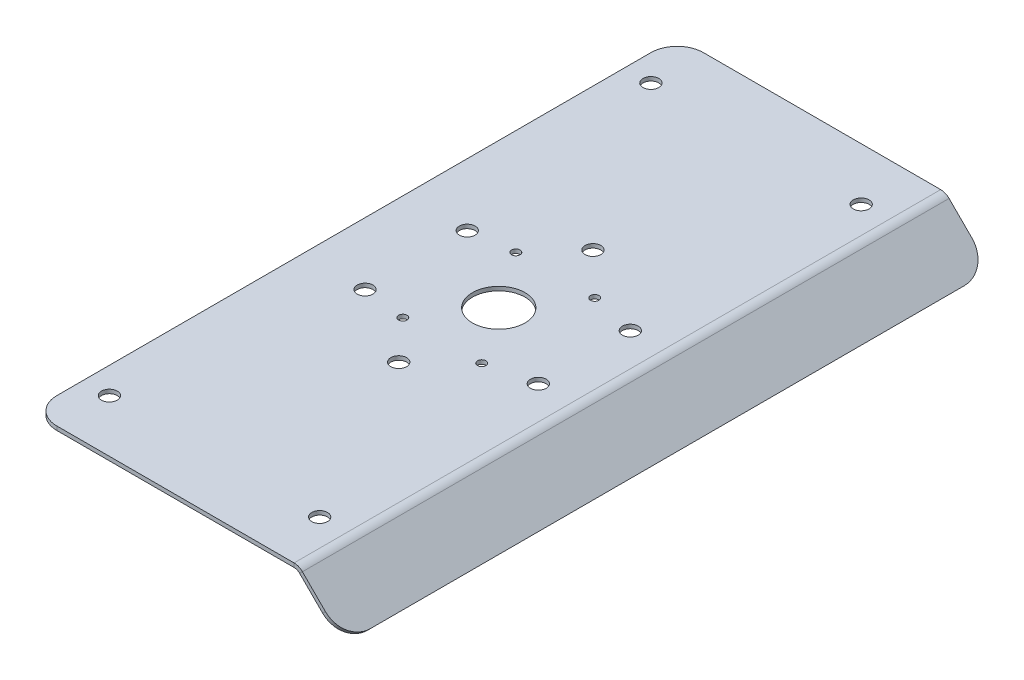
ISO-10303-21;
HEADER;
FILE_DESCRIPTION(('STEP AP214'),'2;1');
FILE_NAME('part.step','',(''),(''),'','','');
FILE_SCHEMA(('AUTOMOTIVE_DESIGN { 1 0 10303 214 1 1 1 1 }'));
ENDSEC;
DATA;
#1=APPLICATION_CONTEXT('core data for automotive mechanical design processes');
#2=APPLICATION_PROTOCOL_DEFINITION('international standard','automotive_design',2000,#1);
#3=PRODUCT_CONTEXT('',#1,'mechanical');
#4=PRODUCT('Part','Part','',(#3));
#5=PRODUCT_RELATED_PRODUCT_CATEGORY('part','',(#4));
#6=PRODUCT_DEFINITION_FORMATION('','',#4);
#7=PRODUCT_DEFINITION_CONTEXT('part definition',#1,'design');
#8=PRODUCT_DEFINITION('design','',#6,#7);
#9=PRODUCT_DEFINITION_SHAPE('','',#8);
#10=(LENGTH_UNIT() NAMED_UNIT(*) SI_UNIT(.MILLI.,.METRE.));
#11=(NAMED_UNIT(*) PLANE_ANGLE_UNIT() SI_UNIT($,.RADIAN.));
#12=(NAMED_UNIT(*) SI_UNIT($,.STERADIAN.) SOLID_ANGLE_UNIT());
#13=UNCERTAINTY_MEASURE_WITH_UNIT(LENGTH_MEASURE(1.E-05),#10,'distance_accuracy_value','');
#14=(GEOMETRIC_REPRESENTATION_CONTEXT(3) GLOBAL_UNCERTAINTY_ASSIGNED_CONTEXT((#13)) GLOBAL_UNIT_ASSIGNED_CONTEXT((#10,
#11,#12)) REPRESENTATION_CONTEXT('',''));
#15=CARTESIAN_POINT('',(0.,0.,0.));
#16=DIRECTION('',(0.,0.,1.));
#17=DIRECTION('',(1.,0.,0.));
#18=AXIS2_PLACEMENT_3D('',#15,#16,#17);
#19=CARTESIAN_POINT('',(-20.9507486527882,97.9999999999998,246.));
#20=DIRECTION('',(0.,0.,1.));
#21=DIRECTION('',(1.,0.,0.));
#22=AXIS2_PLACEMENT_3D('',#19,#20,#21);
#23=PLANE('',#22);
#24=DIRECTION('',(0.,1.,0.));
#25=VECTOR('',#24,1.);
#26=CARTESIAN_POINT('',(-20.9507486527882,97.9999999999998,246.));
#27=LINE('',#26,#25);
#28=CARTESIAN_POINT('',(-20.9507486527882,97.9999999999998,246.));
#29=VERTEX_POINT('',#28);
#30=CARTESIAN_POINT('',(-20.9507486527882,99.4999999999998,246.));
#31=VERTEX_POINT('',#30);
#32=EDGE_CURVE('E139',#29,#31,#27,.T.);
#33=ORIENTED_EDGE('',*,*,#32,.F.);
#34=CARTESIAN_POINT('',(-20.9507486527882,94.9999999999998,246.));
#35=DIRECTION('',(0.,0.,1.));
#36=DIRECTION('',(1.,0.,0.));
#37=AXIS2_PLACEMENT_3D('',#34,#35,#36);
#38=CIRCLE('',#37,3.);
#39=CARTESIAN_POINT('',(-18.8294283092285,97.1213203435595,246.));
#40=VERTEX_POINT('',#39);
#41=EDGE_CURVE('E136',#29,#40,#38,.F.);
#42=ORIENTED_EDGE('',*,*,#41,.T.);
#43=DIRECTION('',(-0.70710678118655,-0.707106781186545,0.));
#44=VECTOR('',#43,1.);
#45=CARTESIAN_POINT('',(-17.7687681374487,98.1819805153393,246.));
#46=LINE('',#45,#44);
#47=CARTESIAN_POINT('',(-17.7687681374487,98.1819805153393,246.));
#48=VERTEX_POINT('',#47);
#49=EDGE_CURVE('E130',#48,#40,#46,.T.);
#50=ORIENTED_EDGE('',*,*,#49,.F.);
#51=CARTESIAN_POINT('',(-20.9507486527882,94.9999999999998,246.));
#52=DIRECTION('',(0.,0.,1.));
#53=DIRECTION('',(1.,0.,0.));
#54=AXIS2_PLACEMENT_3D('',#51,#52,#53);
#55=CIRCLE('',#54,4.5);
#56=EDGE_CURVE('E134',#31,#48,#55,.F.);
#57=ORIENTED_EDGE('',*,*,#56,.F.);
#58=EDGE_LOOP('',(#33,#42,#50,#57));
#59=FACE_BOUND('',#58,.T.);
#60=ADVANCED_FACE('F38',(#59),#23,.T.);
#61=CARTESIAN_POINT('',(-17.7687681374487,98.1819805153393,246.));
#62=DIRECTION('',(0.,0.,1.));
#63=DIRECTION('',(1.,0.,0.));
#64=AXIS2_PLACEMENT_3D('',#61,#62,#63);
#65=PLANE('',#64);
#66=DIRECTION('',(1.,0.,0.));
#67=VECTOR('',#66,1.);
#68=CARTESIAN_POINT('',(-121.208107965669,99.4999999999998,246.));
#69=LINE('',#68,#67);
#70=CARTESIAN_POINT('',(-111.208107965669,99.4999999999998,246.));
#71=VERTEX_POINT('',#70);
#72=EDGE_CURVE('E166',#71,#31,#69,.T.);
#73=ORIENTED_EDGE('',*,*,#72,.F.);
#74=DIRECTION('',(0.,1.,0.));
#75=VECTOR('',#74,1.);
#76=CARTESIAN_POINT('',(-111.208107965669,98.1819805153393,246.));
#77=LINE('',#76,#75);
#78=CARTESIAN_POINT('',(-111.208107965669,97.9999999999998,246.));
#79=VERTEX_POINT('',#78);
#80=EDGE_CURVE('E243',#71,#79,#77,.F.);
#81=ORIENTED_EDGE('',*,*,#80,.T.);
#82=DIRECTION('',(1.,0.,0.));
#83=VECTOR('',#82,1.);
#84=CARTESIAN_POINT('',(-121.208107965669,97.9999999999998,246.));
#85=LINE('',#84,#83);
#86=EDGE_CURVE('E170',#79,#29,#85,.T.);
#87=ORIENTED_EDGE('',*,*,#86,.T.);
#88=ORIENTED_EDGE('',*,*,#32,.T.);
#89=EDGE_LOOP('',(#73,#81,#87,#88));
#90=FACE_BOUND('',#89,.T.);
#91=ADVANCED_FACE('F475',(#90),#65,.T.);
#92=CARTESIAN_POINT('',(-18.8294283092285,97.1213203435595,0.));
#93=DIRECTION('',(0.,0.,-1.));
#94=DIRECTION('',(-1.,0.,0.));
#95=AXIS2_PLACEMENT_3D('',#92,#93,#94);
#96=PLANE('',#95);
#97=DIRECTION('',(0.70710678118655,0.707106781186545,0.));
#98=VECTOR('',#97,1.);
#99=CARTESIAN_POINT('',(-18.8294283092285,97.1213203435595,0.));
#100=LINE('',#99,#98);
#101=CARTESIAN_POINT('',(-18.8294283092285,97.1213203435595,0.));
#102=VERTEX_POINT('',#101);
#103=CARTESIAN_POINT('',(-17.7687681374487,98.1819805153393,0.));
#104=VERTEX_POINT('',#103);
#105=EDGE_CURVE('E140',#102,#104,#100,.T.);
#106=ORIENTED_EDGE('',*,*,#105,.F.);
#107=CARTESIAN_POINT('',(-20.9507486527882,94.9999999999998,0.));
#108=DIRECTION('',(0.,0.,1.));
#109=DIRECTION('',(1.,0.,0.));
#110=AXIS2_PLACEMENT_3D('',#107,#108,#109);
#111=CIRCLE('',#110,3.);
#112=CARTESIAN_POINT('',(-20.9507486527882,97.9999999999998,0.));
#113=VERTEX_POINT('',#112);
#114=EDGE_CURVE('E195',#113,#102,#111,.F.);
#115=ORIENTED_EDGE('',*,*,#114,.F.);
#116=DIRECTION('',(0.,-1.,0.));
#117=VECTOR('',#116,1.);
#118=CARTESIAN_POINT('',(-20.9507486527882,99.4999999999998,0.));
#119=LINE('',#118,#117);
#120=CARTESIAN_POINT('',(-20.9507486527882,99.4999999999998,0.));
#121=VERTEX_POINT('',#120);
#122=EDGE_CURVE('E221',#121,#113,#119,.T.);
#123=ORIENTED_EDGE('',*,*,#122,.F.);
#124=CARTESIAN_POINT('',(-20.9507486527882,94.9999999999998,0.));
#125=DIRECTION('',(0.,0.,1.));
#126=DIRECTION('',(1.,0.,0.));
#127=AXIS2_PLACEMENT_3D('',#124,#125,#126);
#128=CIRCLE('',#127,4.5);
#129=EDGE_CURVE('E186',#121,#104,#128,.F.);
#130=ORIENTED_EDGE('',*,*,#129,.T.);
#131=EDGE_LOOP('',(#106,#115,#123,#130));
#132=FACE_BOUND('',#131,.T.);
#133=ADVANCED_FACE('F473',(#132),#96,.T.);
#134=CARTESIAN_POINT('',(-20.9507486527882,99.4999999999998,0.));
#135=DIRECTION('',(0.,0.,-1.));
#136=DIRECTION('',(-1.,0.,0.));
#137=AXIS2_PLACEMENT_3D('',#134,#135,#136);
#138=PLANE('',#137);
#139=DIRECTION('',(0.707106781186548,-0.707106781186548,0.));
#140=VECTOR('',#139,1.);
#141=CARTESIAN_POINT('',(-18.6474477938891,99.0606601717797,0.));
#142=LINE('',#141,#140);
#143=CARTESIAN_POINT('',(-9.01040764008524,89.4236200179758,0.));
#144=VERTEX_POINT('',#143);
#145=EDGE_CURVE('E150',#104,#144,#142,.T.);
#146=ORIENTED_EDGE('',*,*,#145,.T.);
#147=DIRECTION('',(-0.70710678118655,-0.707106781186545,0.));
#148=VECTOR('',#147,1.);
#149=CARTESIAN_POINT('',(-9.94238815542475,88.4916395026363,0.));
#150=LINE('',#149,#148);
#151=CARTESIAN_POINT('',(-10.0710678118651,88.362959846196,0.));
#152=VERTEX_POINT('',#151);
#153=EDGE_CURVE('E256',#144,#152,#150,.T.);
#154=ORIENTED_EDGE('',*,*,#153,.T.);
#155=DIRECTION('',(0.707106781186547,-0.707106781186547,0.));
#156=VECTOR('',#155,1.);
#157=CARTESIAN_POINT('',(-19.7081079656689,97.9999999999998,0.));
#158=LINE('',#157,#156);
#159=EDGE_CURVE('E179',#102,#152,#158,.T.);
#160=ORIENTED_EDGE('',*,*,#159,.F.);
#161=ORIENTED_EDGE('',*,*,#105,.T.);
#162=EDGE_LOOP('',(#146,#154,#160,#161));
#163=FACE_BOUND('',#162,.T.);
#164=ADVANCED_FACE('F280',(#163),#138,.T.);
#165=CARTESIAN_POINT('',(-19.7081079656689,97.9999999999998,246.));
#166=DIRECTION('',(0.707106781186547,0.707106781186547,0.));
#167=DIRECTION('',(-0.707106781186548,0.707106781186548,0.));
#168=AXIS2_PLACEMENT_3D('',#165,#166,#167);
#169=PLANE('',#168);
#170=ORIENTED_EDGE('',*,*,#159,.T.);
#171=CARTESIAN_POINT('',(-10.0710678118651,88.362959846196,10.));
#172=DIRECTION('',(0.707106781186547,0.707106781186547,0.));
#173=DIRECTION('',(-0.707106781186548,0.707106781186548,0.));
#174=AXIS2_PLACEMENT_3D('',#171,#172,#173);
#175=CIRCLE('',#174,10.);
#176=CARTESIAN_POINT('',(-2.99999999999958,81.2918920343305,10.));
#177=VERTEX_POINT('',#176);
#178=EDGE_CURVE('E263',#152,#177,#175,.F.);
#179=ORIENTED_EDGE('',*,*,#178,.T.);
#180=DIRECTION('',(0.,0.,-1.));
#181=VECTOR('',#180,1.);
#182=CARTESIAN_POINT('',(-2.99999999999958,81.2918920343305,246.));
#183=LINE('',#182,#181);
#184=CARTESIAN_POINT('',(-2.99999999999958,81.2918920343305,236.));
#185=VERTEX_POINT('',#184);
#186=EDGE_CURVE('E218',#185,#177,#183,.T.);
#187=ORIENTED_EDGE('',*,*,#186,.F.);
#188=CARTESIAN_POINT('',(-10.0710678118651,88.362959846196,236.));
#189=DIRECTION('',(0.707106781186547,0.707106781186547,0.));
#190=DIRECTION('',(-0.707106781186548,0.707106781186548,0.));
#191=AXIS2_PLACEMENT_3D('',#188,#189,#190);
#192=CIRCLE('',#191,10.);
#193=CARTESIAN_POINT('',(-10.0710678118651,88.362959846196,246.));
#194=VERTEX_POINT('',#193);
#195=EDGE_CURVE('E260',#185,#194,#192,.F.);
#196=ORIENTED_EDGE('',*,*,#195,.T.);
#197=DIRECTION('',(0.707106781186547,-0.707106781186547,0.));
#198=VECTOR('',#197,1.);
#199=CARTESIAN_POINT('',(-19.7081079656689,97.9999999999998,246.));
#200=LINE('',#199,#198);
#201=EDGE_CURVE('E160',#40,#194,#200,.T.);
#202=ORIENTED_EDGE('',*,*,#201,.F.);
#203=DIRECTION('',(0.,0.,-1.));
#204=VECTOR('',#203,1.);
#205=CARTESIAN_POINT('',(-18.8294283092285,97.1213203435595,246.));
#206=LINE('',#205,#204);
#207=EDGE_CURVE('E178',#40,#102,#206,.T.);
#208=ORIENTED_EDGE('',*,*,#207,.T.);
#209=EDGE_LOOP('',(#170,#179,#187,#196,#202,#208));
#210=FACE_BOUND('',#209,.T.);
#211=ADVANCED_FACE('F285',(#210),#169,.F.);
#212=CARTESIAN_POINT('',(-1.93933982821976,82.3525522061103,246.));
#213=DIRECTION('',(0.707106781186545,-0.70710678118655,0.));
#214=DIRECTION('',(0.70710678118655,0.707106781186545,0.));
#215=AXIS2_PLACEMENT_3D('',#212,#213,#214);
#216=PLANE('',#215);
#217=ORIENTED_EDGE('',*,*,#186,.T.);
#218=DIRECTION('',(-0.70710678118655,-0.707106781186545,0.));
#219=VECTOR('',#218,1.);
#220=CARTESIAN_POINT('',(-1.93933982821976,82.3525522061103,10.));
#221=LINE('',#220,#219);
#222=CARTESIAN_POINT('',(-1.93933982821976,82.3525522061103,10.));
#223=VERTEX_POINT('',#222);
#224=EDGE_CURVE('E60',#177,#223,#221,.F.);
#225=ORIENTED_EDGE('',*,*,#224,.T.);
#226=DIRECTION('',(0.,0.,-1.));
#227=VECTOR('',#226,1.);
#228=CARTESIAN_POINT('',(-1.93933982821976,82.3525522061103,246.));
#229=LINE('',#228,#227);
#230=CARTESIAN_POINT('',(-1.93933982821976,82.3525522061103,236.));
#231=VERTEX_POINT('',#230);
#232=EDGE_CURVE('E155',#231,#223,#229,.T.);
#233=ORIENTED_EDGE('',*,*,#232,.F.);
#234=DIRECTION('',(-0.70710678118655,-0.707106781186545,0.));
#235=VECTOR('',#234,1.);
#236=CARTESIAN_POINT('',(-1.93933982821976,82.3525522061103,236.));
#237=LINE('',#236,#235);
#238=EDGE_CURVE('E266',#231,#185,#237,.T.);
#239=ORIENTED_EDGE('',*,*,#238,.T.);
#240=EDGE_LOOP('',(#217,#225,#233,#239));
#241=FACE_BOUND('',#240,.T.);
#242=ADVANCED_FACE('F286',(#241),#216,.T.);
#243=CARTESIAN_POINT('',(-18.6474477938891,99.0606601717797,246.));
#244=DIRECTION('',(0.707106781186547,0.707106781186547,0.));
#245=DIRECTION('',(-0.707106781186548,0.707106781186548,0.));
#246=AXIS2_PLACEMENT_3D('',#243,#244,#245);
#247=PLANE('',#246);
#248=ORIENTED_EDGE('',*,*,#232,.T.);
#249=CARTESIAN_POINT('',(-9.01040764008524,89.4236200179758,10.));
#250=DIRECTION('',(0.707106781186547,0.707106781186547,0.));
#251=DIRECTION('',(-0.707106781186548,0.707106781186548,0.));
#252=AXIS2_PLACEMENT_3D('',#249,#250,#251);
#253=CIRCLE('',#252,10.);
#254=EDGE_CURVE('E47',#223,#144,#253,.T.);
#255=ORIENTED_EDGE('',*,*,#254,.T.);
#256=ORIENTED_EDGE('',*,*,#145,.F.);
#257=DIRECTION('',(0.,0.,-1.));
#258=VECTOR('',#257,1.);
#259=CARTESIAN_POINT('',(-17.7687681374487,98.1819805153393,246.));
#260=LINE('',#259,#258);
#261=EDGE_CURVE('E145',#48,#104,#260,.T.);
#262=ORIENTED_EDGE('',*,*,#261,.F.);
#263=DIRECTION('',(0.707106781186548,-0.707106781186548,0.));
#264=VECTOR('',#263,1.);
#265=CARTESIAN_POINT('',(-18.6474477938891,99.0606601717797,246.));
#266=LINE('',#265,#264);
#267=CARTESIAN_POINT('',(-9.01040764008524,89.4236200179758,246.));
#268=VERTEX_POINT('',#267);
#269=EDGE_CURVE('E147',#48,#268,#266,.T.);
#270=ORIENTED_EDGE('',*,*,#269,.T.);
#271=CARTESIAN_POINT('',(-9.01040764008524,89.4236200179758,236.));
#272=DIRECTION('',(0.707106781186547,0.707106781186547,0.));
#273=DIRECTION('',(-0.707106781186548,0.707106781186548,0.));
#274=AXIS2_PLACEMENT_3D('',#271,#272,#273);
#275=CIRCLE('',#274,10.);
#276=EDGE_CURVE('E272',#268,#231,#275,.T.);
#277=ORIENTED_EDGE('',*,*,#276,.T.);
#278=EDGE_LOOP('',(#248,#255,#256,#262,#270,#277));
#279=FACE_BOUND('',#278,.T.);
#280=ADVANCED_FACE('F146',(#279),#247,.T.);
#281=CARTESIAN_POINT('',(-20.9507486527882,94.9999999999998,246.));
#282=DIRECTION('',(0.,0.,-1.));
#283=DIRECTION('',(-1.,0.,0.));
#284=AXIS2_PLACEMENT_3D('',#281,#282,#283);
#285=CYLINDRICAL_SURFACE('',#284,4.5);
#286=ORIENTED_EDGE('',*,*,#129,.F.);
#287=DIRECTION('',(0.,0.,-1.));
#288=VECTOR('',#287,1.);
#289=CARTESIAN_POINT('',(-20.9507486527882,99.4999999999998,246.));
#290=LINE('',#289,#288);
#291=EDGE_CURVE('E156',#31,#121,#290,.T.);
#292=ORIENTED_EDGE('',*,*,#291,.F.);
#293=ORIENTED_EDGE('',*,*,#56,.T.);
#294=ORIENTED_EDGE('',*,*,#261,.T.);
#295=EDGE_LOOP('',(#286,#292,#293,#294));
#296=FACE_BOUND('',#295,.T.);
#297=ADVANCED_FACE('F163',(#296),#285,.T.);
#298=CARTESIAN_POINT('',(-121.208107965669,99.4999999999998,246.));
#299=DIRECTION('',(0.,1.,0.));
#300=DIRECTION('',(0.,0.,1.));
#301=AXIS2_PLACEMENT_3D('',#298,#299,#300);
#302=PLANE('',#301);
#303=CARTESIAN_POINT('',(-67.1989837430009,99.4999999999998,86.0608731068162));
#304=DIRECTION('',(0.,1.,0.));
#305=DIRECTION('',(0.,0.,1.));
#306=AXIS2_PLACEMENT_3D('',#303,#304,#305);
#307=CIRCLE('',#306,2.99999999999999);
#308=CARTESIAN_POINT('',(-67.1989837430009,99.4999999999998,89.0608731068162));
#309=VERTEX_POINT('',#308);
#310=EDGE_CURVE('E373',#309,#309,#307,.T.);
#311=ORIENTED_EDGE('',*,*,#310,.F.);
#312=EDGE_LOOP('',(#311));
#313=FACE_BOUND('',#312,.T.);
#314=CARTESIAN_POINT('',(-97.5098728754562,99.4999999999998,103.560873106816));
#315=DIRECTION('',(0.,1.,0.));
#316=DIRECTION('',(0.,0.,1.));
#317=AXIS2_PLACEMENT_3D('',#314,#315,#316);
#318=CIRCLE('',#317,2.99999999999999);
#319=CARTESIAN_POINT('',(-97.5098728754562,99.4999999999998,106.560873106816));
#320=VERTEX_POINT('',#319);
#321=EDGE_CURVE('E381',#320,#320,#318,.T.);
#322=ORIENTED_EDGE('',*,*,#321,.F.);
#323=EDGE_LOOP('',(#322));
#324=FACE_BOUND('',#323,.T.);
#325=CARTESIAN_POINT('',(-97.5098728754562,99.4999999999998,142.439126893183));
#326=DIRECTION('',(0.,1.,0.));
#327=DIRECTION('',(0.,0.,1.));
#328=AXIS2_PLACEMENT_3D('',#325,#326,#327);
#329=CIRCLE('',#328,2.99999999999999);
#330=CARTESIAN_POINT('',(-97.5098728754562,99.4999999999998,145.439126893183));
#331=VERTEX_POINT('',#330);
#332=EDGE_CURVE('E389',#331,#331,#329,.T.);
#333=ORIENTED_EDGE('',*,*,#332,.F.);
#334=EDGE_LOOP('',(#333));
#335=FACE_BOUND('',#334,.T.);
#336=CARTESIAN_POINT('',(-67.1989837430008,99.4999999999998,159.939126893183));
#337=DIRECTION('',(0.,1.,0.));
#338=DIRECTION('',(0.,0.,1.));
#339=AXIS2_PLACEMENT_3D('',#336,#337,#338);
#340=CIRCLE('',#339,3.00000000000002);
#341=CARTESIAN_POINT('',(-67.1989837430008,99.4999999999998,162.939126893183));
#342=VERTEX_POINT('',#341);
#343=EDGE_CURVE('E397',#342,#342,#340,.T.);
#344=ORIENTED_EDGE('',*,*,#343,.F.);
#345=EDGE_LOOP('',(#344));
#346=FACE_BOUND('',#345,.T.);
#347=CARTESIAN_POINT('',(-33.5294283092285,99.4999999999998,140.5));
#348=DIRECTION('',(0.,1.,0.));
#349=DIRECTION('',(0.,0.,1.));
#350=AXIS2_PLACEMENT_3D('',#347,#348,#349);
#351=CIRCLE('',#350,3.);
#352=CARTESIAN_POINT('',(-33.5294283092285,99.4999999999998,143.5));
#353=VERTEX_POINT('',#352);
#354=EDGE_CURVE('E405',#353,#353,#351,.T.);
#355=ORIENTED_EDGE('',*,*,#354,.F.);
#356=EDGE_LOOP('',(#355));
#357=FACE_BOUND('',#356,.T.);
#358=CARTESIAN_POINT('',(-33.5294283092285,99.4999999999998,105.5));
#359=DIRECTION('',(0.,1.,0.));
#360=DIRECTION('',(0.,0.,1.));
#361=AXIS2_PLACEMENT_3D('',#358,#359,#360);
#362=CIRCLE('',#361,3.);
#363=CARTESIAN_POINT('',(-33.5294283092285,99.4999999999998,108.5));
#364=VERTEX_POINT('',#363);
#365=EDGE_CURVE('E365',#364,#364,#362,.T.);
#366=ORIENTED_EDGE('',*,*,#365,.F.);
#367=EDGE_LOOP('',(#366));
#368=FACE_BOUND('',#367,.T.);
#369=CARTESIAN_POINT('',(-51.0794283092285,99.4999999999998,144.5));
#370=DIRECTION('',(0.,1.,0.));
#371=DIRECTION('',(0.,0.,-1.));
#372=AXIS2_PLACEMENT_3D('',#369,#370,#371);
#373=CIRCLE('',#372,1.6);
#374=CARTESIAN_POINT('',(-51.0794283092285,99.4999999999998,142.9));
#375=VERTEX_POINT('',#374);
#376=EDGE_CURVE('E333',#375,#375,#373,.T.);
#377=ORIENTED_EDGE('',*,*,#376,.F.);
#378=EDGE_LOOP('',(#377));
#379=FACE_BOUND('',#378,.T.);
#380=CARTESIAN_POINT('',(-81.0794283092285,99.4999999999998,144.5));
#381=DIRECTION('',(0.,1.,0.));
#382=DIRECTION('',(0.,0.,-1.));
#383=AXIS2_PLACEMENT_3D('',#380,#381,#382);
#384=CIRCLE('',#383,1.6);
#385=CARTESIAN_POINT('',(-81.0794283092285,99.4999999999998,142.9));
#386=VERTEX_POINT('',#385);
#387=EDGE_CURVE('E342',#386,#386,#384,.T.);
#388=ORIENTED_EDGE('',*,*,#387,.F.);
#389=EDGE_LOOP('',(#388));
#390=FACE_BOUND('',#389,.T.);
#391=CARTESIAN_POINT('',(-81.0794283092285,99.4999999999998,101.5));
#392=DIRECTION('',(0.,1.,0.));
#393=DIRECTION('',(0.,0.,1.));
#394=AXIS2_PLACEMENT_3D('',#391,#392,#393);
#395=CIRCLE('',#394,1.60000000000001);
#396=CARTESIAN_POINT('',(-81.0794283092285,99.4999999999998,103.1));
#397=VERTEX_POINT('',#396);
#398=EDGE_CURVE('E350',#397,#397,#395,.T.);
#399=ORIENTED_EDGE('',*,*,#398,.F.);
#400=EDGE_LOOP('',(#399));
#401=FACE_BOUND('',#400,.T.);
#402=CARTESIAN_POINT('',(-51.0794283092285,99.4999999999998,101.5));
#403=DIRECTION('',(0.,1.,0.));
#404=DIRECTION('',(0.,0.,1.));
#405=AXIS2_PLACEMENT_3D('',#402,#403,#404);
#406=CIRCLE('',#405,1.6);
#407=CARTESIAN_POINT('',(-51.0794283092285,99.4999999999998,103.1));
#408=VERTEX_POINT('',#407);
#409=EDGE_CURVE('E358',#408,#408,#406,.T.);
#410=ORIENTED_EDGE('',*,*,#409,.F.);
#411=EDGE_LOOP('',(#410));
#412=FACE_BOUND('',#411,.T.);
#413=CARTESIAN_POINT('',(-66.0794283092257,99.4999999999998,122.999999999995));
#414=DIRECTION('',(0.,1.,0.));
#415=DIRECTION('',(0.,0.,1.));
#416=AXIS2_PLACEMENT_3D('',#413,#414,#415);
#417=CIRCLE('',#416,10.);
#418=CARTESIAN_POINT('',(-66.0794283092257,99.4999999999998,132.999999999995));
#419=VERTEX_POINT('',#418);
#420=EDGE_CURVE('E325',#419,#419,#417,.T.);
#421=ORIENTED_EDGE('',*,*,#420,.F.);
#422=EDGE_LOOP('',(#421));
#423=FACE_BOUND('',#422,.T.);
#424=CARTESIAN_POINT('',(-111.208107965669,99.4999999999998,225.999999999999));
#425=DIRECTION('',(0.,1.,0.));
#426=DIRECTION('',(0.,0.,1.));
#427=AXIS2_PLACEMENT_3D('',#424,#425,#426);
#428=CIRCLE('',#427,3.00000000000001);
#429=CARTESIAN_POINT('',(-111.208107965669,99.4999999999998,228.999999999999));
#430=VERTEX_POINT('',#429);
#431=EDGE_CURVE('E301',#430,#430,#428,.T.);
#432=ORIENTED_EDGE('',*,*,#431,.F.);
#433=EDGE_LOOP('',(#432));
#434=FACE_BOUND('',#433,.T.);
#435=CARTESIAN_POINT('',(-31.2081079656688,99.4999999999998,226.));
#436=DIRECTION('',(0.,1.,0.));
#437=DIRECTION('',(0.,0.,1.));
#438=AXIS2_PLACEMENT_3D('',#435,#436,#437);
#439=CIRCLE('',#438,3.);
#440=CARTESIAN_POINT('',(-31.2081079656688,99.4999999999998,229.));
#441=VERTEX_POINT('',#440);
#442=EDGE_CURVE('E310',#441,#441,#439,.T.);
#443=ORIENTED_EDGE('',*,*,#442,.F.);
#444=EDGE_LOOP('',(#443));
#445=FACE_BOUND('',#444,.T.);
#446=CARTESIAN_POINT('',(-31.208107965668,99.4999999999998,20.0000000000001));
#447=DIRECTION('',(0.,1.,0.));
#448=DIRECTION('',(0.,0.,1.));
#449=AXIS2_PLACEMENT_3D('',#446,#447,#448);
#450=CIRCLE('',#449,3.);
#451=CARTESIAN_POINT('',(-31.208107965668,99.4999999999998,23.0000000000001));
#452=VERTEX_POINT('',#451);
#453=EDGE_CURVE('E318',#452,#452,#450,.T.);
#454=ORIENTED_EDGE('',*,*,#453,.F.);
#455=EDGE_LOOP('',(#454));
#456=FACE_BOUND('',#455,.T.);
#457=CARTESIAN_POINT('',(-111.208107965668,99.4999999999998,20.0000000000001));
#458=DIRECTION('',(0.,1.,0.));
#459=DIRECTION('',(0.,0.,1.));
#460=AXIS2_PLACEMENT_3D('',#457,#458,#459);
#461=CIRCLE('',#460,2.99999999999999);
#462=CARTESIAN_POINT('',(-111.208107965668,99.4999999999998,23.0000000000001));
#463=VERTEX_POINT('',#462);
#464=EDGE_CURVE('E293',#463,#463,#461,.T.);
#465=ORIENTED_EDGE('',*,*,#464,.F.);
#466=EDGE_LOOP('',(#465));
#467=FACE_BOUND('',#466,.T.);
#468=DIRECTION('',(0.,0.,-1.));
#469=VECTOR('',#468,1.);
#470=CARTESIAN_POINT('',(-121.208107965669,99.4999999999998,246.));
#471=LINE('',#470,#469);
#472=CARTESIAN_POINT('',(-121.208107965669,99.4999999999998,236.));
#473=VERTEX_POINT('',#472);
#474=CARTESIAN_POINT('',(-121.208107965669,99.4999999999998,10.));
#475=VERTEX_POINT('',#474);
#476=EDGE_CURVE('E210',#473,#475,#471,.T.);
#477=ORIENTED_EDGE('',*,*,#476,.F.);
#478=CARTESIAN_POINT('',(-111.208107965669,99.4999999999998,236.));
#479=DIRECTION('',(0.,1.,0.));
#480=DIRECTION('',(0.,0.,1.));
#481=AXIS2_PLACEMENT_3D('',#478,#479,#480);
#482=CIRCLE('',#481,10.);
#483=EDGE_CURVE('E240',#473,#71,#482,.T.);
#484=ORIENTED_EDGE('',*,*,#483,.T.);
#485=ORIENTED_EDGE('',*,*,#72,.T.);
#486=ORIENTED_EDGE('',*,*,#291,.T.);
#487=DIRECTION('',(1.,0.,0.));
#488=VECTOR('',#487,1.);
#489=CARTESIAN_POINT('',(-121.208107965669,99.4999999999998,0.));
#490=LINE('',#489,#488);
#491=CARTESIAN_POINT('',(-111.208107965669,99.4999999999998,0.));
#492=VERTEX_POINT('',#491);
#493=EDGE_CURVE('E189',#492,#121,#490,.T.);
#494=ORIENTED_EDGE('',*,*,#493,.F.);
#495=CARTESIAN_POINT('',(-111.208107965669,99.4999999999998,10.));
#496=DIRECTION('',(0.,1.,0.));
#497=DIRECTION('',(0.,0.,1.));
#498=AXIS2_PLACEMENT_3D('',#495,#496,#497);
#499=CIRCLE('',#498,10.);
#500=EDGE_CURVE('E237',#492,#475,#499,.T.);
#501=ORIENTED_EDGE('',*,*,#500,.T.);
#502=EDGE_LOOP('',(#477,#484,#485,#486,#494,#501));
#503=FACE_BOUND('',#502,.T.);
#504=ADVANCED_FACE('F425',(#313,#324,#335,#346,#357,#368,#379,#390,#401,#412,#423,#434,#445,
#456,#467,#503),#302,.T.);
#505=CARTESIAN_POINT('',(-121.208107965669,97.9999999999998,246.));
#506=DIRECTION('',(-1.,0.,0.));
#507=DIRECTION('',(0.,0.,1.));
#508=AXIS2_PLACEMENT_3D('',#505,#506,#507);
#509=PLANE('',#508);
#510=DIRECTION('',(0.,0.,-1.));
#511=VECTOR('',#510,1.);
#512=CARTESIAN_POINT('',(-121.208107965669,97.9999999999998,246.));
#513=LINE('',#512,#511);
#514=CARTESIAN_POINT('',(-121.208107965669,97.9999999999998,236.));
#515=VERTEX_POINT('',#514);
#516=CARTESIAN_POINT('',(-121.208107965669,97.9999999999998,10.));
#517=VERTEX_POINT('',#516);
#518=EDGE_CURVE('E206',#515,#517,#513,.T.);
#519=ORIENTED_EDGE('',*,*,#518,.F.);
#520=DIRECTION('',(0.,1.,0.));
#521=VECTOR('',#520,1.);
#522=CARTESIAN_POINT('',(-121.208107965669,97.9999999999998,236.));
#523=LINE('',#522,#521);
#524=EDGE_CURVE('E233',#515,#473,#523,.T.);
#525=ORIENTED_EDGE('',*,*,#524,.T.);
#526=ORIENTED_EDGE('',*,*,#476,.T.);
#527=DIRECTION('',(0.,1.,0.));
#528=VECTOR('',#527,1.);
#529=CARTESIAN_POINT('',(-121.208107965669,97.9999999999998,10.));
#530=LINE('',#529,#528);
#531=EDGE_CURVE('E230',#475,#517,#530,.F.);
#532=ORIENTED_EDGE('',*,*,#531,.T.);
#533=EDGE_LOOP('',(#519,#525,#526,#532));
#534=FACE_BOUND('',#533,.T.);
#535=ADVANCED_FACE('F428',(#534),#509,.T.);
#536=CARTESIAN_POINT('',(-121.208107965669,97.9999999999998,246.));
#537=DIRECTION('',(0.,1.,0.));
#538=DIRECTION('',(0.,0.,1.));
#539=AXIS2_PLACEMENT_3D('',#536,#537,#538);
#540=PLANE('',#539);
#541=CARTESIAN_POINT('',(-67.1989837430009,97.9999999999998,86.0608731068162));
#542=DIRECTION('',(0.,1.,0.));
#543=DIRECTION('',(0.,0.,1.));
#544=AXIS2_PLACEMENT_3D('',#541,#542,#543);
#545=CIRCLE('',#544,2.99999999999999);
#546=CARTESIAN_POINT('',(-67.1989837430009,97.9999999999998,89.0608731068162));
#547=VERTEX_POINT('',#546);
#548=EDGE_CURVE('E377',#547,#547,#545,.T.);
#549=ORIENTED_EDGE('',*,*,#548,.T.);
#550=EDGE_LOOP('',(#549));
#551=FACE_BOUND('',#550,.T.);
#552=CARTESIAN_POINT('',(-97.5098728754562,97.9999999999998,103.560873106816));
#553=DIRECTION('',(0.,1.,0.));
#554=DIRECTION('',(0.,0.,1.));
#555=AXIS2_PLACEMENT_3D('',#552,#553,#554);
#556=CIRCLE('',#555,2.99999999999999);
#557=CARTESIAN_POINT('',(-97.5098728754562,97.9999999999998,106.560873106816));
#558=VERTEX_POINT('',#557);
#559=EDGE_CURVE('E385',#558,#558,#556,.T.);
#560=ORIENTED_EDGE('',*,*,#559,.T.);
#561=EDGE_LOOP('',(#560));
#562=FACE_BOUND('',#561,.T.);
#563=CARTESIAN_POINT('',(-97.5098728754562,97.9999999999998,142.439126893183));
#564=DIRECTION('',(0.,1.,0.));
#565=DIRECTION('',(0.,0.,1.));
#566=AXIS2_PLACEMENT_3D('',#563,#564,#565);
#567=CIRCLE('',#566,2.99999999999999);
#568=CARTESIAN_POINT('',(-97.5098728754562,97.9999999999998,145.439126893183));
#569=VERTEX_POINT('',#568);
#570=EDGE_CURVE('E393',#569,#569,#567,.T.);
#571=ORIENTED_EDGE('',*,*,#570,.T.);
#572=EDGE_LOOP('',(#571));
#573=FACE_BOUND('',#572,.T.);
#574=CARTESIAN_POINT('',(-67.1989837430008,97.9999999999998,159.939126893183));
#575=DIRECTION('',(0.,1.,0.));
#576=DIRECTION('',(0.,0.,1.));
#577=AXIS2_PLACEMENT_3D('',#574,#575,#576);
#578=CIRCLE('',#577,3.00000000000002);
#579=CARTESIAN_POINT('',(-67.1989837430008,97.9999999999998,162.939126893183));
#580=VERTEX_POINT('',#579);
#581=EDGE_CURVE('E401',#580,#580,#578,.T.);
#582=ORIENTED_EDGE('',*,*,#581,.T.);
#583=EDGE_LOOP('',(#582));
#584=FACE_BOUND('',#583,.T.);
#585=CARTESIAN_POINT('',(-33.5294283092285,97.9999999999998,140.5));
#586=DIRECTION('',(0.,1.,0.));
#587=DIRECTION('',(0.,0.,1.));
#588=AXIS2_PLACEMENT_3D('',#585,#586,#587);
#589=CIRCLE('',#588,3.);
#590=CARTESIAN_POINT('',(-33.5294283092285,97.9999999999998,143.5));
#591=VERTEX_POINT('',#590);
#592=EDGE_CURVE('E369',#591,#591,#589,.T.);
#593=ORIENTED_EDGE('',*,*,#592,.T.);
#594=EDGE_LOOP('',(#593));
#595=FACE_BOUND('',#594,.T.);
#596=CARTESIAN_POINT('',(-33.5294283092285,97.9999999999998,105.5));
#597=DIRECTION('',(0.,1.,0.));
#598=DIRECTION('',(0.,0.,1.));
#599=AXIS2_PLACEMENT_3D('',#596,#597,#598);
#600=CIRCLE('',#599,3.);
#601=CARTESIAN_POINT('',(-33.5294283092285,97.9999999999998,108.5));
#602=VERTEX_POINT('',#601);
#603=EDGE_CURVE('E338',#602,#602,#600,.T.);
#604=ORIENTED_EDGE('',*,*,#603,.T.);
#605=EDGE_LOOP('',(#604));
#606=FACE_BOUND('',#605,.T.);
#607=CARTESIAN_POINT('',(-51.0794283092285,97.9999999999998,144.5));
#608=DIRECTION('',(0.,1.,0.));
#609=DIRECTION('',(0.,0.,-1.));
#610=AXIS2_PLACEMENT_3D('',#607,#608,#609);
#611=CIRCLE('',#610,1.6);
#612=CARTESIAN_POINT('',(-51.0794283092285,97.9999999999998,142.9));
#613=VERTEX_POINT('',#612);
#614=EDGE_CURVE('E337',#613,#613,#611,.T.);
#615=ORIENTED_EDGE('',*,*,#614,.T.);
#616=EDGE_LOOP('',(#615));
#617=FACE_BOUND('',#616,.T.);
#618=CARTESIAN_POINT('',(-81.0794283092285,97.9999999999998,144.5));
#619=DIRECTION('',(0.,1.,0.));
#620=DIRECTION('',(0.,0.,-1.));
#621=AXIS2_PLACEMENT_3D('',#618,#619,#620);
#622=CIRCLE('',#621,1.6);
#623=CARTESIAN_POINT('',(-81.0794283092285,97.9999999999998,142.9));
#624=VERTEX_POINT('',#623);
#625=EDGE_CURVE('E346',#624,#624,#622,.T.);
#626=ORIENTED_EDGE('',*,*,#625,.T.);
#627=EDGE_LOOP('',(#626));
#628=FACE_BOUND('',#627,.T.);
#629=CARTESIAN_POINT('',(-81.0794283092285,97.9999999999998,101.5));
#630=DIRECTION('',(0.,1.,0.));
#631=DIRECTION('',(0.,0.,1.));
#632=AXIS2_PLACEMENT_3D('',#629,#630,#631);
#633=CIRCLE('',#632,1.60000000000001);
#634=CARTESIAN_POINT('',(-81.0794283092285,97.9999999999998,103.1));
#635=VERTEX_POINT('',#634);
#636=EDGE_CURVE('E354',#635,#635,#633,.T.);
#637=ORIENTED_EDGE('',*,*,#636,.T.);
#638=EDGE_LOOP('',(#637));
#639=FACE_BOUND('',#638,.T.);
#640=CARTESIAN_POINT('',(-51.0794283092285,97.9999999999998,101.5));
#641=DIRECTION('',(0.,1.,0.));
#642=DIRECTION('',(0.,0.,1.));
#643=AXIS2_PLACEMENT_3D('',#640,#641,#642);
#644=CIRCLE('',#643,1.6);
#645=CARTESIAN_POINT('',(-51.0794283092285,97.9999999999998,103.1));
#646=VERTEX_POINT('',#645);
#647=EDGE_CURVE('E329',#646,#646,#644,.T.);
#648=ORIENTED_EDGE('',*,*,#647,.T.);
#649=EDGE_LOOP('',(#648));
#650=FACE_BOUND('',#649,.T.);
#651=CARTESIAN_POINT('',(-66.0794283092257,97.9999999999998,122.999999999995));
#652=DIRECTION('',(0.,1.,0.));
#653=DIRECTION('',(0.,0.,1.));
#654=AXIS2_PLACEMENT_3D('',#651,#652,#653);
#655=CIRCLE('',#654,10.);
#656=CARTESIAN_POINT('',(-66.0794283092257,97.9999999999998,132.999999999995));
#657=VERTEX_POINT('',#656);
#658=EDGE_CURVE('E306',#657,#657,#655,.T.);
#659=ORIENTED_EDGE('',*,*,#658,.T.);
#660=EDGE_LOOP('',(#659));
#661=FACE_BOUND('',#660,.T.);
#662=CARTESIAN_POINT('',(-111.208107965669,97.9999999999998,225.999999999999));
#663=DIRECTION('',(0.,1.,0.));
#664=DIRECTION('',(0.,0.,1.));
#665=AXIS2_PLACEMENT_3D('',#662,#663,#664);
#666=CIRCLE('',#665,3.00000000000001);
#667=CARTESIAN_POINT('',(-111.208107965669,97.9999999999998,228.999999999999));
#668=VERTEX_POINT('',#667);
#669=EDGE_CURVE('E305',#668,#668,#666,.T.);
#670=ORIENTED_EDGE('',*,*,#669,.T.);
#671=EDGE_LOOP('',(#670));
#672=FACE_BOUND('',#671,.T.);
#673=CARTESIAN_POINT('',(-31.2081079656688,97.9999999999998,226.));
#674=DIRECTION('',(0.,1.,0.));
#675=DIRECTION('',(0.,0.,1.));
#676=AXIS2_PLACEMENT_3D('',#673,#674,#675);
#677=CIRCLE('',#676,3.);
#678=CARTESIAN_POINT('',(-31.2081079656688,97.9999999999998,229.));
#679=VERTEX_POINT('',#678);
#680=EDGE_CURVE('E314',#679,#679,#677,.T.);
#681=ORIENTED_EDGE('',*,*,#680,.T.);
#682=EDGE_LOOP('',(#681));
#683=FACE_BOUND('',#682,.T.);
#684=CARTESIAN_POINT('',(-31.208107965668,97.9999999999998,20.0000000000001));
#685=DIRECTION('',(0.,1.,0.));
#686=DIRECTION('',(0.,0.,1.));
#687=AXIS2_PLACEMENT_3D('',#684,#685,#686);
#688=CIRCLE('',#687,3.);
#689=CARTESIAN_POINT('',(-31.208107965668,97.9999999999998,23.0000000000001));
#690=VERTEX_POINT('',#689);
#691=EDGE_CURVE('E297',#690,#690,#688,.T.);
#692=ORIENTED_EDGE('',*,*,#691,.T.);
#693=EDGE_LOOP('',(#692));
#694=FACE_BOUND('',#693,.T.);
#695=CARTESIAN_POINT('',(-111.208107965668,97.9999999999998,20.0000000000001));
#696=DIRECTION('',(0.,1.,0.));
#697=DIRECTION('',(0.,0.,1.));
#698=AXIS2_PLACEMENT_3D('',#695,#696,#697);
#699=CIRCLE('',#698,2.99999999999999);
#700=CARTESIAN_POINT('',(-111.208107965668,97.9999999999998,23.0000000000001));
#701=VERTEX_POINT('',#700);
#702=EDGE_CURVE('E183',#701,#701,#699,.T.);
#703=ORIENTED_EDGE('',*,*,#702,.T.);
#704=EDGE_LOOP('',(#703));
#705=FACE_BOUND('',#704,.T.);
#706=ORIENTED_EDGE('',*,*,#86,.F.);
#707=CARTESIAN_POINT('',(-111.208107965669,97.9999999999998,236.));
#708=DIRECTION('',(0.,1.,0.));
#709=DIRECTION('',(0.,0.,1.));
#710=AXIS2_PLACEMENT_3D('',#707,#708,#709);
#711=CIRCLE('',#710,10.);
#712=EDGE_CURVE('E249',#79,#515,#711,.F.);
#713=ORIENTED_EDGE('',*,*,#712,.T.);
#714=ORIENTED_EDGE('',*,*,#518,.T.);
#715=CARTESIAN_POINT('',(-111.208107965669,97.9999999999998,10.));
#716=DIRECTION('',(0.,1.,0.));
#717=DIRECTION('',(0.,0.,1.));
#718=AXIS2_PLACEMENT_3D('',#715,#716,#717);
#719=CIRCLE('',#718,10.);
#720=CARTESIAN_POINT('',(-111.208107965669,97.9999999999998,0.));
#721=VERTEX_POINT('',#720);
#722=EDGE_CURVE('E246',#517,#721,#719,.F.);
#723=ORIENTED_EDGE('',*,*,#722,.T.);
#724=DIRECTION('',(1.,0.,0.));
#725=VECTOR('',#724,1.);
#726=CARTESIAN_POINT('',(-121.208107965669,97.9999999999998,0.));
#727=LINE('',#726,#725);
#728=EDGE_CURVE('E192',#721,#113,#727,.T.);
#729=ORIENTED_EDGE('',*,*,#728,.T.);
#730=DIRECTION('',(0.,0.,-1.));
#731=VECTOR('',#730,1.);
#732=CARTESIAN_POINT('',(-20.9507486527882,97.9999999999998,246.));
#733=LINE('',#732,#731);
#734=EDGE_CURVE('E202',#29,#113,#733,.T.);
#735=ORIENTED_EDGE('',*,*,#734,.F.);
#736=EDGE_LOOP('',(#706,#713,#714,#723,#729,#735));
#737=FACE_BOUND('',#736,.T.);
#738=ADVANCED_FACE('F414',(#551,#562,#573,#584,#595,#606,#617,#628,#639,#650,#661,#672,#683,
#694,#705,#737),#540,.F.);
#739=CARTESIAN_POINT('',(-20.9507486527882,94.9999999999998,246.));
#740=DIRECTION('',(0.,0.,-1.));
#741=DIRECTION('',(-1.,0.,0.));
#742=AXIS2_PLACEMENT_3D('',#739,#740,#741);
#743=CYLINDRICAL_SURFACE('',#742,3.);
#744=ORIENTED_EDGE('',*,*,#114,.T.);
#745=ORIENTED_EDGE('',*,*,#207,.F.);
#746=ORIENTED_EDGE('',*,*,#41,.F.);
#747=ORIENTED_EDGE('',*,*,#734,.T.);
#748=EDGE_LOOP('',(#744,#745,#746,#747));
#749=FACE_BOUND('',#748,.T.);
#750=ADVANCED_FACE('F472',(#749),#743,.F.);
#751=CARTESIAN_POINT('',(-20.9507486527882,94.9999999999998,246.));
#752=DIRECTION('',(0.,0.,1.));
#753=DIRECTION('',(1.,0.,0.));
#754=AXIS2_PLACEMENT_3D('',#751,#752,#753);
#755=PLANE('',#754);
#756=ORIENTED_EDGE('',*,*,#201,.T.);
#757=DIRECTION('',(-0.70710678118655,-0.707106781186545,0.));
#758=VECTOR('',#757,1.);
#759=CARTESIAN_POINT('',(-12.1923881554247,86.2416395026363,246.));
#760=LINE('',#759,#758);
#761=EDGE_CURVE('E11',#194,#268,#760,.F.);
#762=ORIENTED_EDGE('',*,*,#761,.T.);
#763=ORIENTED_EDGE('',*,*,#269,.F.);
#764=ORIENTED_EDGE('',*,*,#49,.T.);
#765=EDGE_LOOP('',(#756,#762,#763,#764));
#766=FACE_BOUND('',#765,.T.);
#767=ADVANCED_FACE('F158',(#766),#755,.T.);
#768=CARTESIAN_POINT('',(-20.9507486527882,94.9999999999998,0.));
#769=DIRECTION('',(0.,0.,1.));
#770=DIRECTION('',(1.,0.,0.));
#771=AXIS2_PLACEMENT_3D('',#768,#769,#770);
#772=PLANE('',#771);
#773=ORIENTED_EDGE('',*,*,#728,.F.);
#774=DIRECTION('',(0.,1.,0.));
#775=VECTOR('',#774,1.);
#776=CARTESIAN_POINT('',(-111.208107965669,99.4999999999998,0.));
#777=LINE('',#776,#775);
#778=EDGE_CURVE('E252',#721,#492,#777,.T.);
#779=ORIENTED_EDGE('',*,*,#778,.T.);
#780=ORIENTED_EDGE('',*,*,#493,.T.);
#781=ORIENTED_EDGE('',*,*,#122,.T.);
#782=EDGE_LOOP('',(#773,#779,#780,#781));
#783=FACE_BOUND('',#782,.T.);
#784=ADVANCED_FACE('F467',(#783),#772,.F.);
#785=CARTESIAN_POINT('',(-111.208107965669,97.9999999999998,236.));
#786=DIRECTION('',(0.,1.,0.));
#787=DIRECTION('',(0.,0.,1.));
#788=AXIS2_PLACEMENT_3D('',#785,#786,#787);
#789=CYLINDRICAL_SURFACE('',#788,10.);
#790=ORIENTED_EDGE('',*,*,#712,.F.);
#791=ORIENTED_EDGE('',*,*,#80,.F.);
#792=ORIENTED_EDGE('',*,*,#483,.F.);
#793=ORIENTED_EDGE('',*,*,#524,.F.);
#794=EDGE_LOOP('',(#790,#791,#792,#793));
#795=FACE_BOUND('',#794,.T.);
#796=ADVANCED_FACE('F489',(#795),#789,.T.);
#797=CARTESIAN_POINT('',(-111.208107965669,94.9999999999998,10.));
#798=DIRECTION('',(0.,-1.,0.));
#799=DIRECTION('',(0.,0.,-1.));
#800=AXIS2_PLACEMENT_3D('',#797,#798,#799);
#801=CYLINDRICAL_SURFACE('',#800,10.);
#802=ORIENTED_EDGE('',*,*,#722,.F.);
#803=ORIENTED_EDGE('',*,*,#531,.F.);
#804=ORIENTED_EDGE('',*,*,#500,.F.);
#805=ORIENTED_EDGE('',*,*,#778,.F.);
#806=EDGE_LOOP('',(#802,#803,#804,#805));
#807=FACE_BOUND('',#806,.T.);
#808=ADVANCED_FACE('F460',(#807),#801,.T.);
#809=CARTESIAN_POINT('',(-9.94238815542475,88.4916395026363,10.));
#810=DIRECTION('',(-0.70710678118655,-0.707106781186545,0.));
#811=DIRECTION('',(0.707106781186545,-0.70710678118655,0.));
#812=AXIS2_PLACEMENT_3D('',#809,#810,#811);
#813=CYLINDRICAL_SURFACE('',#812,10.);
#814=ORIENTED_EDGE('',*,*,#254,.F.);
#815=ORIENTED_EDGE('',*,*,#224,.F.);
#816=ORIENTED_EDGE('',*,*,#178,.F.);
#817=ORIENTED_EDGE('',*,*,#153,.F.);
#818=EDGE_LOOP('',(#814,#815,#816,#817));
#819=FACE_BOUND('',#818,.T.);
#820=ADVANCED_FACE('F282',(#819),#813,.T.);
#821=CARTESIAN_POINT('',(-9.01040764008521,89.4236200179758,236.));
#822=DIRECTION('',(-0.70710678118655,-0.707106781186545,0.));
#823=DIRECTION('',(0.707106781186545,-0.70710678118655,0.));
#824=AXIS2_PLACEMENT_3D('',#821,#822,#823);
#825=CYLINDRICAL_SURFACE('',#824,10.);
#826=ORIENTED_EDGE('',*,*,#276,.F.);
#827=ORIENTED_EDGE('',*,*,#761,.F.);
#828=ORIENTED_EDGE('',*,*,#195,.F.);
#829=ORIENTED_EDGE('',*,*,#238,.F.);
#830=EDGE_LOOP('',(#826,#827,#828,#829));
#831=FACE_BOUND('',#830,.T.);
#832=ADVANCED_FACE('F40',(#831),#825,.T.);
#833=CARTESIAN_POINT('',(-111.208107965668,97.9999999999998,20.0000000000001));
#834=DIRECTION('',(0.,1.,0.));
#835=DIRECTION('',(0.,0.,1.));
#836=AXIS2_PLACEMENT_3D('',#833,#834,#835);
#837=CYLINDRICAL_SURFACE('',#836,2.99999999999999);
#838=ORIENTED_EDGE('',*,*,#702,.F.);
#839=EDGE_LOOP('',(#838));
#840=FACE_BOUND('',#839,.T.);
#841=ORIENTED_EDGE('',*,*,#464,.T.);
#842=EDGE_LOOP('',(#841));
#843=FACE_BOUND('',#842,.T.);
#844=ADVANCED_FACE('F498',(#840,#843),#837,.F.);
#845=CARTESIAN_POINT('',(-31.208107965668,97.9999999999998,20.0000000000001));
#846=DIRECTION('',(0.,1.,0.));
#847=DIRECTION('',(0.,0.,1.));
#848=AXIS2_PLACEMENT_3D('',#845,#846,#847);
#849=CYLINDRICAL_SURFACE('',#848,3.);
#850=ORIENTED_EDGE('',*,*,#691,.F.);
#851=EDGE_LOOP('',(#850));
#852=FACE_BOUND('',#851,.T.);
#853=ORIENTED_EDGE('',*,*,#453,.T.);
#854=EDGE_LOOP('',(#853));
#855=FACE_BOUND('',#854,.T.);
#856=ADVANCED_FACE('F502',(#852,#855),#849,.F.);
#857=CARTESIAN_POINT('',(-31.2081079656688,97.9999999999998,226.));
#858=DIRECTION('',(0.,1.,0.));
#859=DIRECTION('',(0.,0.,1.));
#860=AXIS2_PLACEMENT_3D('',#857,#858,#859);
#861=CYLINDRICAL_SURFACE('',#860,3.);
#862=ORIENTED_EDGE('',*,*,#680,.F.);
#863=EDGE_LOOP('',(#862));
#864=FACE_BOUND('',#863,.T.);
#865=ORIENTED_EDGE('',*,*,#442,.T.);
#866=EDGE_LOOP('',(#865));
#867=FACE_BOUND('',#866,.T.);
#868=ADVANCED_FACE('F508',(#864,#867),#861,.F.);
#869=CARTESIAN_POINT('',(-111.208107965669,97.9999999999998,225.999999999999));
#870=DIRECTION('',(0.,1.,0.));
#871=DIRECTION('',(0.,0.,1.));
#872=AXIS2_PLACEMENT_3D('',#869,#870,#871);
#873=CYLINDRICAL_SURFACE('',#872,3.00000000000001);
#874=ORIENTED_EDGE('',*,*,#669,.F.);
#875=EDGE_LOOP('',(#874));
#876=FACE_BOUND('',#875,.T.);
#877=ORIENTED_EDGE('',*,*,#431,.T.);
#878=EDGE_LOOP('',(#877));
#879=FACE_BOUND('',#878,.T.);
#880=ADVANCED_FACE('F515',(#876,#879),#873,.F.);
#881=CARTESIAN_POINT('',(-66.0794283092257,97.9999999999998,122.999999999995));
#882=DIRECTION('',(0.,1.,0.));
#883=DIRECTION('',(0.,0.,1.));
#884=AXIS2_PLACEMENT_3D('',#881,#882,#883);
#885=CYLINDRICAL_SURFACE('',#884,10.);
#886=ORIENTED_EDGE('',*,*,#658,.F.);
#887=EDGE_LOOP('',(#886));
#888=FACE_BOUND('',#887,.T.);
#889=ORIENTED_EDGE('',*,*,#420,.T.);
#890=EDGE_LOOP('',(#889));
#891=FACE_BOUND('',#890,.T.);
#892=ADVANCED_FACE('F618',(#888,#891),#885,.F.);
#893=CARTESIAN_POINT('',(-51.0794283092285,97.9999999999998,101.5));
#894=DIRECTION('',(0.,1.,0.));
#895=DIRECTION('',(0.,0.,1.));
#896=AXIS2_PLACEMENT_3D('',#893,#894,#895);
#897=CYLINDRICAL_SURFACE('',#896,1.6);
#898=ORIENTED_EDGE('',*,*,#647,.F.);
#899=EDGE_LOOP('',(#898));
#900=FACE_BOUND('',#899,.T.);
#901=ORIENTED_EDGE('',*,*,#409,.T.);
#902=EDGE_LOOP('',(#901));
#903=FACE_BOUND('',#902,.T.);
#904=ADVANCED_FACE('F627',(#900,#903),#897,.F.);
#905=CARTESIAN_POINT('',(-81.0794283092285,97.9999999999998,101.5));
#906=DIRECTION('',(0.,1.,0.));
#907=DIRECTION('',(0.,0.,1.));
#908=AXIS2_PLACEMENT_3D('',#905,#906,#907);
#909=CYLINDRICAL_SURFACE('',#908,1.60000000000001);
#910=ORIENTED_EDGE('',*,*,#636,.F.);
#911=EDGE_LOOP('',(#910));
#912=FACE_BOUND('',#911,.T.);
#913=ORIENTED_EDGE('',*,*,#398,.T.);
#914=EDGE_LOOP('',(#913));
#915=FACE_BOUND('',#914,.T.);
#916=ADVANCED_FACE('F637',(#912,#915),#909,.F.);
#917=CARTESIAN_POINT('',(-81.0794283092285,97.9999999999998,144.5));
#918=DIRECTION('',(0.,1.,0.));
#919=DIRECTION('',(0.,0.,1.));
#920=AXIS2_PLACEMENT_3D('',#917,#918,#919);
#921=CYLINDRICAL_SURFACE('',#920,1.6);
#922=ORIENTED_EDGE('',*,*,#625,.F.);
#923=EDGE_LOOP('',(#922));
#924=FACE_BOUND('',#923,.T.);
#925=ORIENTED_EDGE('',*,*,#387,.T.);
#926=EDGE_LOOP('',(#925));
#927=FACE_BOUND('',#926,.T.);
#928=ADVANCED_FACE('F647',(#924,#927),#921,.F.);
#929=CARTESIAN_POINT('',(-51.0794283092285,97.9999999999998,144.5));
#930=DIRECTION('',(0.,1.,0.));
#931=DIRECTION('',(0.,0.,1.));
#932=AXIS2_PLACEMENT_3D('',#929,#930,#931);
#933=CYLINDRICAL_SURFACE('',#932,1.6);
#934=ORIENTED_EDGE('',*,*,#614,.F.);
#935=EDGE_LOOP('',(#934));
#936=FACE_BOUND('',#935,.T.);
#937=ORIENTED_EDGE('',*,*,#376,.T.);
#938=EDGE_LOOP('',(#937));
#939=FACE_BOUND('',#938,.T.);
#940=ADVANCED_FACE('F657',(#936,#939),#933,.F.);
#941=CARTESIAN_POINT('',(-33.5294283092285,97.9999999999998,105.5));
#942=DIRECTION('',(0.,1.,0.));
#943=DIRECTION('',(0.,0.,1.));
#944=AXIS2_PLACEMENT_3D('',#941,#942,#943);
#945=CYLINDRICAL_SURFACE('',#944,3.);
#946=ORIENTED_EDGE('',*,*,#603,.F.);
#947=EDGE_LOOP('',(#946));
#948=FACE_BOUND('',#947,.T.);
#949=ORIENTED_EDGE('',*,*,#365,.T.);
#950=EDGE_LOOP('',(#949));
#951=FACE_BOUND('',#950,.T.);
#952=ADVANCED_FACE('F421',(#948,#951),#945,.F.);
#953=CARTESIAN_POINT('',(-33.5294283092285,97.9999999999998,140.5));
#954=DIRECTION('',(0.,1.,0.));
#955=DIRECTION('',(0.,0.,1.));
#956=AXIS2_PLACEMENT_3D('',#953,#954,#955);
#957=CYLINDRICAL_SURFACE('',#956,3.);
#958=ORIENTED_EDGE('',*,*,#592,.F.);
#959=EDGE_LOOP('',(#958));
#960=FACE_BOUND('',#959,.T.);
#961=ORIENTED_EDGE('',*,*,#354,.T.);
#962=EDGE_LOOP('',(#961));
#963=FACE_BOUND('',#962,.T.);
#964=ADVANCED_FACE('F417',(#960,#963),#957,.F.);
#965=CARTESIAN_POINT('',(-67.1989837430008,97.9999999999998,159.939126893183));
#966=DIRECTION('',(0.,1.,0.));
#967=DIRECTION('',(0.,0.,1.));
#968=AXIS2_PLACEMENT_3D('',#965,#966,#967);
#969=CYLINDRICAL_SURFACE('',#968,3.00000000000002);
#970=ORIENTED_EDGE('',*,*,#581,.F.);
#971=EDGE_LOOP('',(#970));
#972=FACE_BOUND('',#971,.T.);
#973=ORIENTED_EDGE('',*,*,#343,.T.);
#974=EDGE_LOOP('',(#973));
#975=FACE_BOUND('',#974,.T.);
#976=ADVANCED_FACE('F420',(#972,#975),#969,.F.);
#977=CARTESIAN_POINT('',(-97.5098728754562,97.9999999999998,142.439126893183));
#978=DIRECTION('',(0.,1.,0.));
#979=DIRECTION('',(0.,0.,1.));
#980=AXIS2_PLACEMENT_3D('',#977,#978,#979);
#981=CYLINDRICAL_SURFACE('',#980,2.99999999999999);
#982=ORIENTED_EDGE('',*,*,#570,.F.);
#983=EDGE_LOOP('',(#982));
#984=FACE_BOUND('',#983,.T.);
#985=ORIENTED_EDGE('',*,*,#332,.T.);
#986=EDGE_LOOP('',(#985));
#987=FACE_BOUND('',#986,.T.);
#988=ADVANCED_FACE('F691',(#984,#987),#981,.F.);
#989=CARTESIAN_POINT('',(-97.5098728754562,97.9999999999998,103.560873106816));
#990=DIRECTION('',(0.,1.,0.));
#991=DIRECTION('',(0.,0.,1.));
#992=AXIS2_PLACEMENT_3D('',#989,#990,#991);
#993=CYLINDRICAL_SURFACE('',#992,2.99999999999999);
#994=ORIENTED_EDGE('',*,*,#559,.F.);
#995=EDGE_LOOP('',(#994));
#996=FACE_BOUND('',#995,.T.);
#997=ORIENTED_EDGE('',*,*,#321,.T.);
#998=EDGE_LOOP('',(#997));
#999=FACE_BOUND('',#998,.T.);
#1000=ADVANCED_FACE('F701',(#996,#999),#993,.F.);
#1001=CARTESIAN_POINT('',(-67.1989837430009,97.9999999999998,86.0608731068162));
#1002=DIRECTION('',(0.,1.,0.));
#1003=DIRECTION('',(0.,0.,1.));
#1004=AXIS2_PLACEMENT_3D('',#1001,#1002,#1003);
#1005=CYLINDRICAL_SURFACE('',#1004,2.99999999999999);
#1006=ORIENTED_EDGE('',*,*,#548,.F.);
#1007=EDGE_LOOP('',(#1006));
#1008=FACE_BOUND('',#1007,.T.);
#1009=ORIENTED_EDGE('',*,*,#310,.T.);
#1010=EDGE_LOOP('',(#1009));
#1011=FACE_BOUND('',#1010,.T.);
#1012=ADVANCED_FACE('F711',(#1008,#1011),#1005,.F.);
#1013=CLOSED_SHELL('',(#60,#91,#133,#164,#211,#242,#280,#297,#504,#535,#738,#750,#767,#784,#796,
#808,#820,#832,#844,#856,#868,#880,#892,#904,#916,#928,#940,#952,#964,#976,#988,#1000,#1012));
#1014=MANIFOLD_SOLID_BREP('B2',#1013);
#1015=ADVANCED_BREP_SHAPE_REPRESENTATION('',(#18,#1014),#14);
#1016=SHAPE_DEFINITION_REPRESENTATION(#9,#1015);
ENDSEC;
END-ISO-10303-21;
